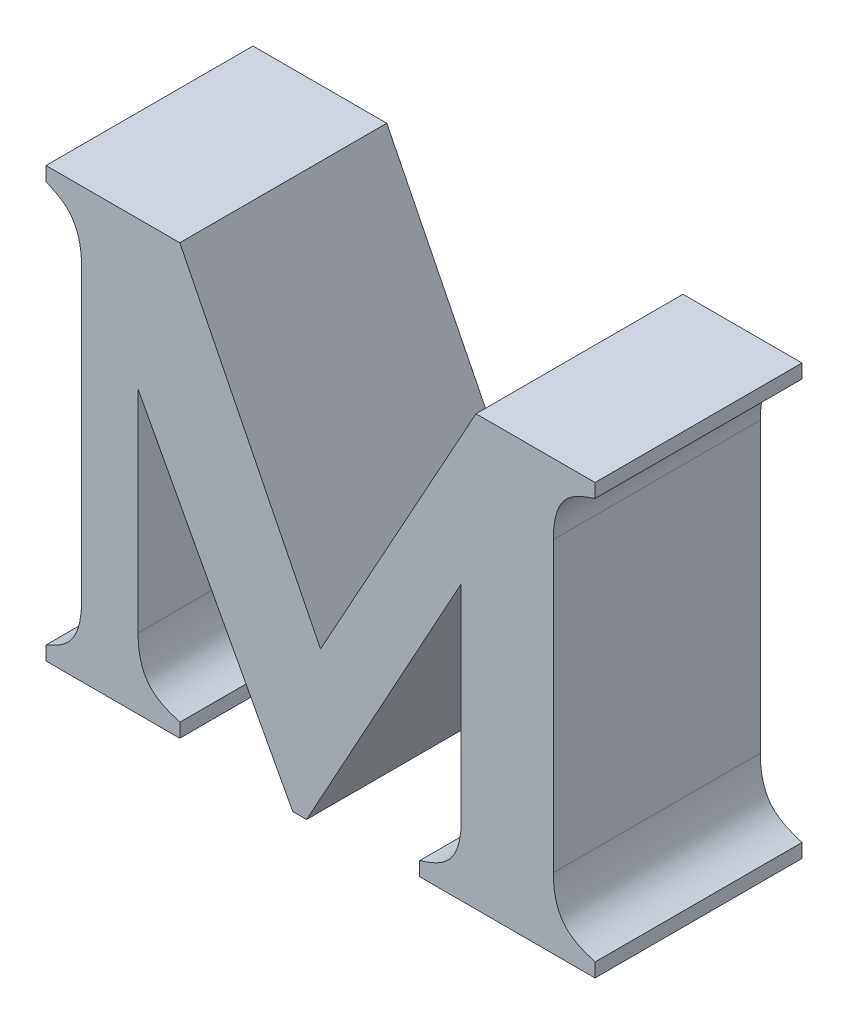
ISO-10303-21;
HEADER;
FILE_DESCRIPTION(('STEP AP214'),'2;1');
FILE_NAME('part.step','',(''),(''),'','','');
FILE_SCHEMA(('AUTOMOTIVE_DESIGN { 1 0 10303 214 1 1 1 1 }'));
ENDSEC;
DATA;
#1=APPLICATION_CONTEXT('core data for automotive mechanical design processes');
#2=APPLICATION_PROTOCOL_DEFINITION('international standard','automotive_design',2000,#1);
#3=PRODUCT_CONTEXT('',#1,'mechanical');
#4=PRODUCT('Part','Part','',(#3));
#5=PRODUCT_RELATED_PRODUCT_CATEGORY('part','',(#4));
#6=PRODUCT_DEFINITION_FORMATION('','',#4);
#7=PRODUCT_DEFINITION_CONTEXT('part definition',#1,'design');
#8=PRODUCT_DEFINITION('design','',#6,#7);
#9=PRODUCT_DEFINITION_SHAPE('','',#8);
#10=(LENGTH_UNIT() NAMED_UNIT(*) SI_UNIT(.MILLI.,.METRE.));
#11=(NAMED_UNIT(*) PLANE_ANGLE_UNIT() SI_UNIT($,.RADIAN.));
#12=(NAMED_UNIT(*) SI_UNIT($,.STERADIAN.) SOLID_ANGLE_UNIT());
#13=UNCERTAINTY_MEASURE_WITH_UNIT(LENGTH_MEASURE(1.E-05),#10,'distance_accuracy_value','');
#14=(GEOMETRIC_REPRESENTATION_CONTEXT(3) GLOBAL_UNCERTAINTY_ASSIGNED_CONTEXT((#13)) GLOBAL_UNIT_ASSIGNED_CONTEXT((#10,
#11,#12)) REPRESENTATION_CONTEXT('',''));
#15=CARTESIAN_POINT('',(0.,0.,0.));
#16=DIRECTION('',(0.,0.,1.));
#17=DIRECTION('',(1.,0.,0.));
#18=AXIS2_PLACEMENT_3D('',#15,#16,#17);
#19=CARTESIAN_POINT('',(1.967855914945,-0.25995003071244,0.));
#20=CARTESIAN_POINT('',(1.967855914945,-0.25995003071244,0.1));
#21=CARTESIAN_POINT('',(1.974991382156,-0.26330769945751,0.));
#22=CARTESIAN_POINT('',(1.974991382156,-0.26330769945751,0.1));
#23=CARTESIAN_POINT('',(1.985065074674,-0.26666549298124,0.));
#24=CARTESIAN_POINT('',(1.985065074674,-0.26666549298124,0.1));
#25=CARTESIAN_POINT('',(1.985065074674,-0.28723157278345,0.));
#26=CARTESIAN_POINT('',(1.985065074674,-0.28723157278345,0.1));
#27=B_SPLINE_SURFACE_WITH_KNOTS('',3,1,((#19,#20),(#21,#22),(#23,#24),(#25,#26)),.UNSPECIFIED.,
.F.,.F.,.F.,(4,4),(2,2),(-1.,0.),(0.,0.01),.UNSPECIFIED.);
#28=CARTESIAN_POINT('',(1.985065074674,-0.28723157278345,0.));
#29=CARTESIAN_POINT('',(1.985065074674,-0.26666549298124,0.));
#30=CARTESIAN_POINT('',(1.974991382156,-0.26330769945751,0.));
#31=CARTESIAN_POINT('',(1.967855914945,-0.25995003071244,0.));
#32=B_SPLINE_CURVE_WITH_KNOTS('',3,(#28,#29,#30,#31),.UNSPECIFIED.,.F.,.F.,(4,4),(0.,1.),.UNSPECIFIED.);
#33=CARTESIAN_POINT('',(1.985065074674,-0.28723157278345,0.));
#34=VERTEX_POINT('',#33);
#35=CARTESIAN_POINT('',(1.967855914945,-0.25995003071244,0.));
#36=VERTEX_POINT('',#35);
#37=EDGE_CURVE('E11',#34,#36,#32,.T.);
#38=DIRECTION('',(0.,0.,1.));
#39=VECTOR('',#38,1.);
#40=CARTESIAN_POINT('',(1.985065074674,-0.28723157278345,0.));
#41=LINE('',#40,#39);
#42=CARTESIAN_POINT('',(1.985065074674,-0.28723157278345,0.1));
#43=VERTEX_POINT('',#42);
#44=EDGE_CURVE('E28',#34,#43,#41,.T.);
#45=CARTESIAN_POINT('',(1.967855914945,-0.25995003071244,0.1));
#46=CARTESIAN_POINT('',(1.974991382156,-0.26330769945751,0.1));
#47=CARTESIAN_POINT('',(1.985065074674,-0.26666549298124,0.1));
#48=CARTESIAN_POINT('',(1.985065074674,-0.28723157278345,0.1));
#49=B_SPLINE_CURVE_WITH_KNOTS('',3,(#45,#46,#47,#48),.UNSPECIFIED.,.F.,.F.,(4,4),(-1.,0.),.UNSPECIFIED.);
#50=CARTESIAN_POINT('',(1.967855914945,-0.25995003071244,0.1));
#51=VERTEX_POINT('',#50);
#52=EDGE_CURVE('E206',#51,#43,#49,.T.);
#53=DIRECTION('',(0.,0.,1.));
#54=VECTOR('',#53,1.);
#55=CARTESIAN_POINT('',(1.967855914945,-0.25995003071244,0.));
#56=LINE('',#55,#54);
#57=EDGE_CURVE('E433',#36,#51,#56,.T.);
#58=ORIENTED_EDGE('',*,*,#37,.F.);
#59=ORIENTED_EDGE('',*,*,#44,.T.);
#60=ORIENTED_EDGE('',*,*,#52,.F.);
#61=ORIENTED_EDGE('',*,*,#57,.F.);
#62=EDGE_LOOP('',(#58,#59,#60,#61));
#63=FACE_BOUND('',#62,.T.);
#64=ADVANCED_FACE('F17',(#63),#27,.T.);
#65=CARTESIAN_POINT('',(1.967855914945,-0.25323453724898,0.));
#66=DIRECTION('',(-1.,0.,0.));
#67=DIRECTION('',(0.,-1.,0.));
#68=AXIS2_PLACEMENT_3D('',#65,#66,#67);
#69=PLANE('',#68);
#70=DIRECTION('',(0.,1.,0.));
#71=VECTOR('',#70,1.);
#72=CARTESIAN_POINT('',(1.967855914945,-0.25995003071244,0.));
#73=LINE('',#72,#71);
#74=CARTESIAN_POINT('',(1.967855914945,-0.25323453724898,0.));
#75=VERTEX_POINT('',#74);
#76=EDGE_CURVE('E431',#36,#75,#73,.T.);
#77=ORIENTED_EDGE('',*,*,#76,.F.);
#78=ORIENTED_EDGE('',*,*,#57,.T.);
#79=DIRECTION('',(0.,-1.,0.));
#80=VECTOR('',#79,1.);
#81=CARTESIAN_POINT('',(1.967855914945,-0.25995003071244,0.1));
#82=LINE('',#81,#80);
#83=CARTESIAN_POINT('',(1.967855914945,-0.25323453724898,0.1));
#84=VERTEX_POINT('',#83);
#85=EDGE_CURVE('E429',#84,#51,#82,.T.);
#86=ORIENTED_EDGE('',*,*,#85,.F.);
#87=DIRECTION('',(0.,0.,1.));
#88=VECTOR('',#87,1.);
#89=CARTESIAN_POINT('',(1.967855914945,-0.25323453724898,0.));
#90=LINE('',#89,#88);
#91=EDGE_CURVE('E426',#75,#84,#90,.T.);
#92=ORIENTED_EDGE('',*,*,#91,.F.);
#93=EDGE_LOOP('',(#77,#78,#86,#92));
#94=FACE_BOUND('',#93,.T.);
#95=ADVANCED_FACE('F528',(#94),#69,.T.);
#96=CARTESIAN_POINT('',(2.032492504437,-0.25323453724898,0.));
#97=DIRECTION('',(0.,1.,0.));
#98=DIRECTION('',(-1.,0.,0.));
#99=AXIS2_PLACEMENT_3D('',#96,#97,#98);
#100=PLANE('',#99);
#101=DIRECTION('',(1.,0.,0.));
#102=VECTOR('',#101,1.);
#103=CARTESIAN_POINT('',(1.967855914945,-0.25323453724898,0.));
#104=LINE('',#103,#102);
#105=CARTESIAN_POINT('',(2.032492504437,-0.25323453724898,0.));
#106=VERTEX_POINT('',#105);
#107=EDGE_CURVE('E424',#75,#106,#104,.T.);
#108=ORIENTED_EDGE('',*,*,#107,.F.);
#109=ORIENTED_EDGE('',*,*,#91,.T.);
#110=DIRECTION('',(-1.,0.,0.));
#111=VECTOR('',#110,1.);
#112=CARTESIAN_POINT('',(1.967855914945,-0.25323453724898,0.1));
#113=LINE('',#112,#111);
#114=CARTESIAN_POINT('',(2.032492504437,-0.25323453724898,0.1));
#115=VERTEX_POINT('',#114);
#116=EDGE_CURVE('E421',#115,#84,#113,.T.);
#117=ORIENTED_EDGE('',*,*,#116,.F.);
#118=DIRECTION('',(0.,0.,1.));
#119=VECTOR('',#118,1.);
#120=CARTESIAN_POINT('',(2.032492504437,-0.25323453724898,0.));
#121=LINE('',#120,#119);
#122=EDGE_CURVE('E418',#106,#115,#121,.T.);
#123=ORIENTED_EDGE('',*,*,#122,.F.);
#124=EDGE_LOOP('',(#108,#109,#117,#123));
#125=FACE_BOUND('',#124,.T.);
#126=ADVANCED_FACE('F524',(#125),#100,.T.);
#127=CARTESIAN_POINT('',(2.100486575506,-0.389222679387,0.));
#128=DIRECTION('',(0.894427190999942,0.447213595499906,0.));
#129=DIRECTION('',(-0.447213595499906,0.894427190999942,0.));
#130=AXIS2_PLACEMENT_3D('',#127,#128,#129);
#131=PLANE('',#130);
#132=DIRECTION('',(0.447213595499906,-0.894427190999942,0.));
#133=VECTOR('',#132,1.);
#134=CARTESIAN_POINT('',(2.032492504437,-0.25323453724898,0.));
#135=LINE('',#134,#133);
#136=CARTESIAN_POINT('',(2.100486575506,-0.389222679387,0.));
#137=VERTEX_POINT('',#136);
#138=EDGE_CURVE('E416',#106,#137,#135,.T.);
#139=ORIENTED_EDGE('',*,*,#138,.F.);
#140=ORIENTED_EDGE('',*,*,#122,.T.);
#141=DIRECTION('',(-0.447213595499906,0.894427190999942,0.));
#142=VECTOR('',#141,1.);
#143=CARTESIAN_POINT('',(2.032492504437,-0.25323453724898,0.1));
#144=LINE('',#143,#142);
#145=CARTESIAN_POINT('',(2.100486575506,-0.389222679387,0.1));
#146=VERTEX_POINT('',#145);
#147=EDGE_CURVE('E413',#146,#115,#144,.T.);
#148=ORIENTED_EDGE('',*,*,#147,.F.);
#149=DIRECTION('',(0.,0.,1.));
#150=VECTOR('',#149,1.);
#151=CARTESIAN_POINT('',(2.100486575506,-0.389222679387,0.));
#152=LINE('',#151,#150);
#153=EDGE_CURVE('E410',#137,#146,#152,.T.);
#154=ORIENTED_EDGE('',*,*,#153,.F.);
#155=EDGE_LOOP('',(#139,#140,#148,#154));
#156=FACE_BOUND('',#155,.T.);
#157=ADVANCED_FACE('F520',(#156),#131,.T.);
#158=CARTESIAN_POINT('',(2.175615801839,-0.25323453724898,0.));
#159=DIRECTION('',(-0.875301790518292,0.483577062644076,0.));
#160=DIRECTION('',(-0.483577062644076,-0.875301790518292,0.));
#161=AXIS2_PLACEMENT_3D('',#158,#159,#160);
#162=PLANE('',#161);
#163=DIRECTION('',(0.483577062644076,0.875301790518292,0.));
#164=VECTOR('',#163,1.);
#165=CARTESIAN_POINT('',(2.100486575506,-0.389222679387,0.));
#166=LINE('',#165,#164);
#167=CARTESIAN_POINT('',(2.175615801839,-0.25323453724898,0.));
#168=VERTEX_POINT('',#167);
#169=EDGE_CURVE('E408',#137,#168,#166,.T.);
#170=ORIENTED_EDGE('',*,*,#169,.F.);
#171=ORIENTED_EDGE('',*,*,#153,.T.);
#172=DIRECTION('',(-0.483577062644076,-0.875301790518292,0.));
#173=VECTOR('',#172,1.);
#174=CARTESIAN_POINT('',(2.100486575506,-0.389222679387,0.1));
#175=LINE('',#174,#173);
#176=CARTESIAN_POINT('',(2.175615801839,-0.25323453724898,0.1));
#177=VERTEX_POINT('',#176);
#178=EDGE_CURVE('E405',#177,#146,#175,.T.);
#179=ORIENTED_EDGE('',*,*,#178,.F.);
#180=DIRECTION('',(0.,0.,1.));
#181=VECTOR('',#180,1.);
#182=CARTESIAN_POINT('',(2.175615801839,-0.25323453724898,0.));
#183=LINE('',#182,#181);
#184=EDGE_CURVE('E402',#168,#177,#183,.T.);
#185=ORIENTED_EDGE('',*,*,#184,.F.);
#186=EDGE_LOOP('',(#170,#171,#179,#185));
#187=FACE_BOUND('',#186,.T.);
#188=ADVANCED_FACE('F516',(#187),#162,.T.);
#189=CARTESIAN_POINT('',(2.23311692412,-0.25323453724898,0.));
#190=DIRECTION('',(0.,1.,0.));
#191=DIRECTION('',(-1.,0.,0.));
#192=AXIS2_PLACEMENT_3D('',#189,#190,#191);
#193=PLANE('',#192);
#194=DIRECTION('',(1.,0.,0.));
#195=VECTOR('',#194,1.);
#196=CARTESIAN_POINT('',(2.175615801839,-0.25323453724898,0.));
#197=LINE('',#196,#195);
#198=CARTESIAN_POINT('',(2.23311692412,-0.25323453724898,0.));
#199=VERTEX_POINT('',#198);
#200=EDGE_CURVE('E400',#168,#199,#197,.T.);
#201=ORIENTED_EDGE('',*,*,#200,.F.);
#202=ORIENTED_EDGE('',*,*,#184,.T.);
#203=DIRECTION('',(-1.,0.,0.));
#204=VECTOR('',#203,1.);
#205=CARTESIAN_POINT('',(2.175615801839,-0.25323453724898,0.1));
#206=LINE('',#205,#204);
#207=CARTESIAN_POINT('',(2.23311692412,-0.25323453724898,0.1));
#208=VERTEX_POINT('',#207);
#209=EDGE_CURVE('E397',#208,#177,#206,.T.);
#210=ORIENTED_EDGE('',*,*,#209,.F.);
#211=DIRECTION('',(0.,0.,1.));
#212=VECTOR('',#211,1.);
#213=CARTESIAN_POINT('',(2.23311692412,-0.25323453724898,0.));
#214=LINE('',#213,#212);
#215=EDGE_CURVE('E394',#199,#208,#214,.T.);
#216=ORIENTED_EDGE('',*,*,#215,.F.);
#217=EDGE_LOOP('',(#201,#202,#210,#216));
#218=FACE_BOUND('',#217,.T.);
#219=ADVANCED_FACE('F512',(#218),#193,.T.);
#220=CARTESIAN_POINT('',(2.23311692412,-0.25995003071244,0.));
#221=DIRECTION('',(1.,0.,0.));
#222=DIRECTION('',(0.,1.,0.));
#223=AXIS2_PLACEMENT_3D('',#220,#221,#222);
#224=PLANE('',#223);
#225=DIRECTION('',(0.,-1.,0.));
#226=VECTOR('',#225,1.);
#227=CARTESIAN_POINT('',(2.23311692412,-0.25323453724898,0.));
#228=LINE('',#227,#226);
#229=CARTESIAN_POINT('',(2.23311692412,-0.25995003071244,0.));
#230=VERTEX_POINT('',#229);
#231=EDGE_CURVE('E392',#199,#230,#228,.T.);
#232=ORIENTED_EDGE('',*,*,#231,.F.);
#233=ORIENTED_EDGE('',*,*,#215,.T.);
#234=DIRECTION('',(0.,1.,0.));
#235=VECTOR('',#234,1.);
#236=CARTESIAN_POINT('',(2.23311692412,-0.25323453724898,0.1));
#237=LINE('',#236,#235);
#238=CARTESIAN_POINT('',(2.23311692412,-0.25995003071244,0.1));
#239=VERTEX_POINT('',#238);
#240=EDGE_CURVE('E389',#239,#208,#237,.T.);
#241=ORIENTED_EDGE('',*,*,#240,.F.);
#242=DIRECTION('',(0.,0.,1.));
#243=VECTOR('',#242,1.);
#244=CARTESIAN_POINT('',(2.23311692412,-0.25995003071244,0.));
#245=LINE('',#244,#243);
#246=EDGE_CURVE('E383',#230,#239,#245,.T.);
#247=ORIENTED_EDGE('',*,*,#246,.F.);
#248=EDGE_LOOP('',(#232,#233,#241,#247));
#249=FACE_BOUND('',#248,.T.);
#250=ADVANCED_FACE('F508',(#249),#224,.T.);
#251=CARTESIAN_POINT('',(2.212970786871,-0.28723157278345,0.));
#252=CARTESIAN_POINT('',(2.212970786871,-0.28723157278345,0.1));
#253=CARTESIAN_POINT('',(2.212970786871,-0.26666549298124,0.));
#254=CARTESIAN_POINT('',(2.212970786871,-0.26666549298124,0.1));
#255=CARTESIAN_POINT('',(2.223043231602,-0.26330769945751,0.));
#256=CARTESIAN_POINT('',(2.223043231602,-0.26330769945751,0.1));
#257=CARTESIAN_POINT('',(2.23311692412,-0.25995003071244,0.));
#258=CARTESIAN_POINT('',(2.23311692412,-0.25995003071244,0.1));
#259=B_SPLINE_SURFACE_WITH_KNOTS('',3,1,((#251,#252),(#253,#254),(#255,#256),(#257,#258)),
.UNSPECIFIED.,.F.,.F.,.F.,(4,4),(2,2),(-1.,0.),(0.,0.01),.UNSPECIFIED.);
#260=CARTESIAN_POINT('',(2.23311692412,-0.25995003071244,0.));
#261=CARTESIAN_POINT('',(2.223043231602,-0.26330769945751,0.));
#262=CARTESIAN_POINT('',(2.212970786871,-0.26666549298124,0.));
#263=CARTESIAN_POINT('',(2.212970786871,-0.28723157278345,0.));
#264=B_SPLINE_CURVE_WITH_KNOTS('',3,(#260,#261,#262,#263),.UNSPECIFIED.,.F.,.F.,(4,4),(0.,1.),.UNSPECIFIED.);
#265=CARTESIAN_POINT('',(2.212970786871,-0.28723157278345,0.));
#266=VERTEX_POINT('',#265);
#267=EDGE_CURVE('E376',#230,#266,#264,.T.);
#268=CARTESIAN_POINT('',(2.212970786871,-0.28723157278345,0.1));
#269=CARTESIAN_POINT('',(2.212970786871,-0.26666549298124,0.1));
#270=CARTESIAN_POINT('',(2.223043231602,-0.26330769945751,0.1));
#271=CARTESIAN_POINT('',(2.23311692412,-0.25995003071244,0.1));
#272=B_SPLINE_CURVE_WITH_KNOTS('',3,(#268,#269,#270,#271),.UNSPECIFIED.,.F.,.F.,(4,4),(-1.,0.),.UNSPECIFIED.);
#273=CARTESIAN_POINT('',(2.212970786871,-0.28723157278345,0.1));
#274=VERTEX_POINT('',#273);
#275=EDGE_CURVE('E371',#274,#239,#272,.T.);
#276=DIRECTION('',(0.,0.,1.));
#277=VECTOR('',#276,1.);
#278=CARTESIAN_POINT('',(2.212970786871,-0.28723157278345,0.));
#279=LINE('',#278,#277);
#280=EDGE_CURVE('E368',#266,#274,#279,.T.);
#281=ORIENTED_EDGE('',*,*,#267,.F.);
#282=ORIENTED_EDGE('',*,*,#246,.T.);
#283=ORIENTED_EDGE('',*,*,#275,.F.);
#284=ORIENTED_EDGE('',*,*,#280,.F.);
#285=EDGE_LOOP('',(#281,#282,#283,#284));
#286=FACE_BOUND('',#285,.T.);
#287=ADVANCED_FACE('F504',(#286),#259,.T.);
#288=CARTESIAN_POINT('',(2.212970786871,-0.426577508445,0.));
#289=DIRECTION('',(1.,0.,0.));
#290=DIRECTION('',(0.,1.,0.));
#291=AXIS2_PLACEMENT_3D('',#288,#289,#290);
#292=PLANE('',#291);
#293=DIRECTION('',(0.,-1.,0.));
#294=VECTOR('',#293,1.);
#295=CARTESIAN_POINT('',(2.212970786871,-0.28723157278345,0.));
#296=LINE('',#295,#294);
#297=CARTESIAN_POINT('',(2.212970786871,-0.426577508445,0.));
#298=VERTEX_POINT('',#297);
#299=EDGE_CURVE('E366',#266,#298,#296,.T.);
#300=ORIENTED_EDGE('',*,*,#299,.F.);
#301=ORIENTED_EDGE('',*,*,#280,.T.);
#302=DIRECTION('',(0.,1.,0.));
#303=VECTOR('',#302,1.);
#304=CARTESIAN_POINT('',(2.212970786871,-0.28723157278345,0.1));
#305=LINE('',#304,#303);
#306=CARTESIAN_POINT('',(2.212970786871,-0.426577508445,0.1));
#307=VERTEX_POINT('',#306);
#308=EDGE_CURVE('E363',#307,#274,#305,.T.);
#309=ORIENTED_EDGE('',*,*,#308,.F.);
#310=DIRECTION('',(0.,0.,1.));
#311=VECTOR('',#310,1.);
#312=CARTESIAN_POINT('',(2.212970786871,-0.426577508445,0.));
#313=LINE('',#312,#311);
#314=EDGE_CURVE('E357',#298,#307,#313,.T.);
#315=ORIENTED_EDGE('',*,*,#314,.F.);
#316=EDGE_LOOP('',(#300,#301,#309,#315));
#317=FACE_BOUND('',#316,.T.);
#318=ADVANCED_FACE('F500',(#317),#292,.T.);
#319=CARTESIAN_POINT('',(2.23311692412,-0.453859050516,0.));
#320=CARTESIAN_POINT('',(2.23311692412,-0.453859050516,0.1));
#321=CARTESIAN_POINT('',(2.223043231602,-0.450501256992,0.));
#322=CARTESIAN_POINT('',(2.223043231602,-0.450501256992,0.1));
#323=CARTESIAN_POINT('',(2.212970786871,-0.447143557053,0.));
#324=CARTESIAN_POINT('',(2.212970786871,-0.447143557053,0.1));
#325=CARTESIAN_POINT('',(2.212970786871,-0.426577508445,0.));
#326=CARTESIAN_POINT('',(2.212970786871,-0.426577508445,0.1));
#327=B_SPLINE_SURFACE_WITH_KNOTS('',3,1,((#319,#320),(#321,#322),(#323,#324),(#325,#326)),
.UNSPECIFIED.,.F.,.F.,.F.,(4,4),(2,2),(-1.,0.),(0.,0.01),.UNSPECIFIED.);
#328=CARTESIAN_POINT('',(2.212970786871,-0.426577508445,0.));
#329=CARTESIAN_POINT('',(2.212970786871,-0.447143557053,0.));
#330=CARTESIAN_POINT('',(2.223043231602,-0.450501256992,0.));
#331=CARTESIAN_POINT('',(2.23311692412,-0.453859050516,0.));
#332=B_SPLINE_CURVE_WITH_KNOTS('',3,(#328,#329,#330,#331),.UNSPECIFIED.,.F.,.F.,(4,4),(0.,1.),.UNSPECIFIED.);
#333=CARTESIAN_POINT('',(2.23311692412,-0.453859050516,0.));
#334=VERTEX_POINT('',#333);
#335=EDGE_CURVE('E350',#298,#334,#332,.T.);
#336=CARTESIAN_POINT('',(2.23311692412,-0.453859050516,0.1));
#337=CARTESIAN_POINT('',(2.223043231602,-0.450501256992,0.1));
#338=CARTESIAN_POINT('',(2.212970786871,-0.447143557053,0.1));
#339=CARTESIAN_POINT('',(2.212970786871,-0.426577508445,0.1));
#340=B_SPLINE_CURVE_WITH_KNOTS('',3,(#336,#337,#338,#339),.UNSPECIFIED.,.F.,.F.,(4,4),(-1.,0.),.UNSPECIFIED.);
#341=CARTESIAN_POINT('',(2.23311692412,-0.453859050516,0.1));
#342=VERTEX_POINT('',#341);
#343=EDGE_CURVE('E345',#342,#307,#340,.T.);
#344=DIRECTION('',(0.,0.,1.));
#345=VECTOR('',#344,1.);
#346=CARTESIAN_POINT('',(2.23311692412,-0.453859050516,0.));
#347=LINE('',#346,#345);
#348=EDGE_CURVE('E342',#334,#342,#347,.T.);
#349=ORIENTED_EDGE('',*,*,#335,.F.);
#350=ORIENTED_EDGE('',*,*,#314,.T.);
#351=ORIENTED_EDGE('',*,*,#343,.F.);
#352=ORIENTED_EDGE('',*,*,#348,.F.);
#353=EDGE_LOOP('',(#349,#350,#351,#352));
#354=FACE_BOUND('',#353,.T.);
#355=ADVANCED_FACE('F496',(#354),#327,.T.);
#356=CARTESIAN_POINT('',(2.23311692412,-0.46057454398,0.));
#357=DIRECTION('',(1.,0.,0.));
#358=DIRECTION('',(0.,1.,0.));
#359=AXIS2_PLACEMENT_3D('',#356,#357,#358);
#360=PLANE('',#359);
#361=DIRECTION('',(0.,-1.,0.));
#362=VECTOR('',#361,1.);
#363=CARTESIAN_POINT('',(2.23311692412,-0.453859050516,0.));
#364=LINE('',#363,#362);
#365=CARTESIAN_POINT('',(2.23311692412,-0.46057454398,0.));
#366=VERTEX_POINT('',#365);
#367=EDGE_CURVE('E340',#334,#366,#364,.T.);
#368=ORIENTED_EDGE('',*,*,#367,.F.);
#369=ORIENTED_EDGE('',*,*,#348,.T.);
#370=DIRECTION('',(0.,1.,0.));
#371=VECTOR('',#370,1.);
#372=CARTESIAN_POINT('',(2.23311692412,-0.453859050516,0.1));
#373=LINE('',#372,#371);
#374=CARTESIAN_POINT('',(2.23311692412,-0.46057454398,0.1));
#375=VERTEX_POINT('',#374);
#376=EDGE_CURVE('E337',#375,#342,#373,.T.);
#377=ORIENTED_EDGE('',*,*,#376,.F.);
#378=DIRECTION('',(0.,0.,1.));
#379=VECTOR('',#378,1.);
#380=CARTESIAN_POINT('',(2.23311692412,-0.46057454398,0.));
#381=LINE('',#380,#379);
#382=EDGE_CURVE('E334',#366,#375,#381,.T.);
#383=ORIENTED_EDGE('',*,*,#382,.F.);
#384=EDGE_LOOP('',(#368,#369,#377,#383));
#385=FACE_BOUND('',#384,.T.);
#386=ADVANCED_FACE('F492',(#385),#360,.T.);
#387=CARTESIAN_POINT('',(2.148334197379,-0.46057454398,0.));
#388=DIRECTION('',(0.,-1.,0.));
#389=DIRECTION('',(1.,0.,0.));
#390=AXIS2_PLACEMENT_3D('',#387,#388,#389);
#391=PLANE('',#390);
#392=DIRECTION('',(-1.,0.,0.));
#393=VECTOR('',#392,1.);
#394=CARTESIAN_POINT('',(2.23311692412,-0.46057454398,0.));
#395=LINE('',#394,#393);
#396=CARTESIAN_POINT('',(2.148334197379,-0.46057454398,0.));
#397=VERTEX_POINT('',#396);
#398=EDGE_CURVE('E332',#366,#397,#395,.T.);
#399=ORIENTED_EDGE('',*,*,#398,.F.);
#400=ORIENTED_EDGE('',*,*,#382,.T.);
#401=DIRECTION('',(1.,0.,0.));
#402=VECTOR('',#401,1.);
#403=CARTESIAN_POINT('',(2.23311692412,-0.46057454398,0.1));
#404=LINE('',#403,#402);
#405=CARTESIAN_POINT('',(2.148334197379,-0.46057454398,0.1));
#406=VERTEX_POINT('',#405);
#407=EDGE_CURVE('E329',#406,#375,#404,.T.);
#408=ORIENTED_EDGE('',*,*,#407,.F.);
#409=DIRECTION('',(0.,0.,1.));
#410=VECTOR('',#409,1.);
#411=CARTESIAN_POINT('',(2.148334197379,-0.46057454398,0.));
#412=LINE('',#411,#410);
#413=EDGE_CURVE('E326',#397,#406,#412,.T.);
#414=ORIENTED_EDGE('',*,*,#413,.F.);
#415=EDGE_LOOP('',(#399,#400,#408,#414));
#416=FACE_BOUND('',#415,.T.);
#417=ADVANCED_FACE('F488',(#416),#391,.T.);
#418=CARTESIAN_POINT('',(2.148334197379,-0.453859050516,0.));
#419=DIRECTION('',(-1.,0.,0.));
#420=DIRECTION('',(0.,-1.,0.));
#421=AXIS2_PLACEMENT_3D('',#418,#419,#420);
#422=PLANE('',#421);
#423=DIRECTION('',(0.,1.,0.));
#424=VECTOR('',#423,1.);
#425=CARTESIAN_POINT('',(2.148334197379,-0.46057454398,0.));
#426=LINE('',#425,#424);
#427=CARTESIAN_POINT('',(2.148334197379,-0.453859050516,0.));
#428=VERTEX_POINT('',#427);
#429=EDGE_CURVE('E324',#397,#428,#426,.T.);
#430=ORIENTED_EDGE('',*,*,#429,.F.);
#431=ORIENTED_EDGE('',*,*,#413,.T.);
#432=DIRECTION('',(0.,-1.,0.));
#433=VECTOR('',#432,1.);
#434=CARTESIAN_POINT('',(2.148334197379,-0.46057454398,0.1));
#435=LINE('',#434,#433);
#436=CARTESIAN_POINT('',(2.148334197379,-0.453859050516,0.1));
#437=VERTEX_POINT('',#436);
#438=EDGE_CURVE('E321',#437,#406,#435,.T.);
#439=ORIENTED_EDGE('',*,*,#438,.F.);
#440=DIRECTION('',(0.,0.,1.));
#441=VECTOR('',#440,1.);
#442=CARTESIAN_POINT('',(2.148334197379,-0.453859050516,0.));
#443=LINE('',#442,#441);
#444=EDGE_CURVE('E315',#428,#437,#443,.T.);
#445=ORIENTED_EDGE('',*,*,#444,.F.);
#446=EDGE_LOOP('',(#430,#431,#439,#445));
#447=FACE_BOUND('',#446,.T.);
#448=ADVANCED_FACE('F484',(#447),#422,.T.);
#449=CARTESIAN_POINT('',(2.168480334628,-0.426577508445,0.));
#450=CARTESIAN_POINT('',(2.168480334628,-0.426577508445,0.1));
#451=CARTESIAN_POINT('',(2.168480334628,-0.447143557053,0.));
#452=CARTESIAN_POINT('',(2.168480334628,-0.447143557053,0.1));
#453=CARTESIAN_POINT('',(2.158407889897,-0.450501256992,0.));
#454=CARTESIAN_POINT('',(2.158407889897,-0.450501256992,0.1));
#455=CARTESIAN_POINT('',(2.148334197379,-0.453859050516,0.));
#456=CARTESIAN_POINT('',(2.148334197379,-0.453859050516,0.1));
#457=B_SPLINE_SURFACE_WITH_KNOTS('',3,1,((#449,#450),(#451,#452),(#453,#454),(#455,#456)),
.UNSPECIFIED.,.F.,.F.,.F.,(4,4),(2,2),(-1.,0.),(0.,0.01),.UNSPECIFIED.);
#458=CARTESIAN_POINT('',(2.148334197379,-0.453859050516,0.));
#459=CARTESIAN_POINT('',(2.158407889897,-0.450501256992,0.));
#460=CARTESIAN_POINT('',(2.168480334628,-0.447143557053,0.));
#461=CARTESIAN_POINT('',(2.168480334628,-0.426577508445,0.));
#462=B_SPLINE_CURVE_WITH_KNOTS('',3,(#458,#459,#460,#461),.UNSPECIFIED.,.F.,.F.,(4,4),(0.,1.),.UNSPECIFIED.);
#463=CARTESIAN_POINT('',(2.168480334628,-0.426577508445,0.));
#464=VERTEX_POINT('',#463);
#465=EDGE_CURVE('E308',#428,#464,#462,.T.);
#466=CARTESIAN_POINT('',(2.168480334628,-0.426577508445,0.1));
#467=CARTESIAN_POINT('',(2.168480334628,-0.447143557053,0.1));
#468=CARTESIAN_POINT('',(2.158407889897,-0.450501256992,0.1));
#469=CARTESIAN_POINT('',(2.148334197379,-0.453859050516,0.1));
#470=B_SPLINE_CURVE_WITH_KNOTS('',3,(#466,#467,#468,#469),.UNSPECIFIED.,.F.,.F.,(4,4),(-1.,0.),.UNSPECIFIED.);
#471=CARTESIAN_POINT('',(2.168480334628,-0.426577508445,0.1));
#472=VERTEX_POINT('',#471);
#473=EDGE_CURVE('E303',#472,#437,#470,.T.);
#474=DIRECTION('',(0.,0.,1.));
#475=VECTOR('',#474,1.);
#476=CARTESIAN_POINT('',(2.168480334628,-0.426577508445,0.));
#477=LINE('',#476,#475);
#478=EDGE_CURVE('E300',#464,#472,#477,.T.);
#479=ORIENTED_EDGE('',*,*,#465,.F.);
#480=ORIENTED_EDGE('',*,*,#444,.T.);
#481=ORIENTED_EDGE('',*,*,#473,.F.);
#482=ORIENTED_EDGE('',*,*,#478,.F.);
#483=EDGE_LOOP('',(#479,#480,#481,#482));
#484=FACE_BOUND('',#483,.T.);
#485=ADVANCED_FACE('F480',(#484),#457,.T.);
#486=CARTESIAN_POINT('',(2.168480334628,-0.327944070587,0.));
#487=DIRECTION('',(-1.,0.,0.));
#488=DIRECTION('',(0.,-1.,0.));
#489=AXIS2_PLACEMENT_3D('',#486,#487,#488);
#490=PLANE('',#489);
#491=DIRECTION('',(0.,1.,0.));
#492=VECTOR('',#491,1.);
#493=CARTESIAN_POINT('',(2.168480334628,-0.426577508445,0.));
#494=LINE('',#493,#492);
#495=CARTESIAN_POINT('',(2.168480334628,-0.327944070587,0.));
#496=VERTEX_POINT('',#495);
#497=EDGE_CURVE('E298',#464,#496,#494,.T.);
#498=ORIENTED_EDGE('',*,*,#497,.F.);
#499=ORIENTED_EDGE('',*,*,#478,.T.);
#500=DIRECTION('',(0.,-1.,0.));
#501=VECTOR('',#500,1.);
#502=CARTESIAN_POINT('',(2.168480334628,-0.426577508445,0.1));
#503=LINE('',#502,#501);
#504=CARTESIAN_POINT('',(2.168480334628,-0.327944070587,0.1));
#505=VERTEX_POINT('',#504);
#506=EDGE_CURVE('E295',#505,#472,#503,.T.);
#507=ORIENTED_EDGE('',*,*,#506,.F.);
#508=DIRECTION('',(0.,0.,1.));
#509=VECTOR('',#508,1.);
#510=CARTESIAN_POINT('',(2.168480334628,-0.327944070587,0.));
#511=LINE('',#510,#509);
#512=EDGE_CURVE('E292',#496,#505,#511,.T.);
#513=ORIENTED_EDGE('',*,*,#512,.F.);
#514=EDGE_LOOP('',(#498,#499,#507,#513));
#515=FACE_BOUND('',#514,.T.);
#516=ADVANCED_FACE('F476',(#515),#490,.T.);
#517=CARTESIAN_POINT('',(2.093770988458,-0.463932212725,0.));
#518=DIRECTION('',(0.876444775107035,-0.481502394789039,0.));
#519=DIRECTION('',(0.481502394789039,0.876444775107035,0.));
#520=AXIS2_PLACEMENT_3D('',#517,#518,#519);
#521=PLANE('',#520);
#522=DIRECTION('',(-0.481502394789039,-0.876444775107035,0.));
#523=VECTOR('',#522,1.);
#524=CARTESIAN_POINT('',(2.168480334628,-0.327944070587,0.));
#525=LINE('',#524,#523);
#526=CARTESIAN_POINT('',(2.093770988458,-0.463932212725,0.));
#527=VERTEX_POINT('',#526);
#528=EDGE_CURVE('E290',#496,#527,#525,.T.);
#529=ORIENTED_EDGE('',*,*,#528,.F.);
#530=ORIENTED_EDGE('',*,*,#512,.T.);
#531=DIRECTION('',(0.481502394789039,0.876444775107035,0.));
#532=VECTOR('',#531,1.);
#533=CARTESIAN_POINT('',(2.168480334628,-0.327944070587,0.1));
#534=LINE('',#533,#532);
#535=CARTESIAN_POINT('',(2.093770988458,-0.463932212725,0.1));
#536=VERTEX_POINT('',#535);
#537=EDGE_CURVE('E287',#536,#505,#534,.T.);
#538=ORIENTED_EDGE('',*,*,#537,.F.);
#539=DIRECTION('',(0.,0.,1.));
#540=VECTOR('',#539,1.);
#541=CARTESIAN_POINT('',(2.093770988458,-0.463932212725,0.));
#542=LINE('',#541,#540);
#543=EDGE_CURVE('E284',#527,#536,#542,.T.);
#544=ORIENTED_EDGE('',*,*,#543,.F.);
#545=EDGE_LOOP('',(#529,#530,#538,#544));
#546=FACE_BOUND('',#545,.T.);
#547=ADVANCED_FACE('F472',(#546),#521,.T.);
#548=CARTESIAN_POINT('',(2.087055713357,-0.463932212725,0.));
#549=DIRECTION('',(0.,-1.,0.));
#550=DIRECTION('',(1.,0.,0.));
#551=AXIS2_PLACEMENT_3D('',#548,#549,#550);
#552=PLANE('',#551);
#553=DIRECTION('',(-1.,0.,0.));
#554=VECTOR('',#553,1.);
#555=CARTESIAN_POINT('',(2.093770988458,-0.463932212725,0.));
#556=LINE('',#555,#554);
#557=CARTESIAN_POINT('',(2.087055713357,-0.463932212725,0.));
#558=VERTEX_POINT('',#557);
#559=EDGE_CURVE('E282',#527,#558,#556,.T.);
#560=ORIENTED_EDGE('',*,*,#559,.F.);
#561=ORIENTED_EDGE('',*,*,#543,.T.);
#562=DIRECTION('',(1.,0.,0.));
#563=VECTOR('',#562,1.);
#564=CARTESIAN_POINT('',(2.093770988458,-0.463932212725,0.1));
#565=LINE('',#564,#563);
#566=CARTESIAN_POINT('',(2.087055713357,-0.463932212725,0.1));
#567=VERTEX_POINT('',#566);
#568=EDGE_CURVE('E279',#567,#536,#565,.T.);
#569=ORIENTED_EDGE('',*,*,#568,.F.);
#570=DIRECTION('',(0.,0.,1.));
#571=VECTOR('',#570,1.);
#572=CARTESIAN_POINT('',(2.087055713357,-0.463932212725,0.));
#573=LINE('',#572,#571);
#574=EDGE_CURVE('E276',#558,#567,#573,.T.);
#575=ORIENTED_EDGE('',*,*,#574,.F.);
#576=EDGE_LOOP('',(#560,#561,#569,#575));
#577=FACE_BOUND('',#576,.T.);
#578=ADVANCED_FACE('F468',(#577),#552,.T.);
#579=CARTESIAN_POINT('',(2.012346679134,-0.324586401842,0.));
#580=DIRECTION('',(-0.881323295859111,-0.472513754483438,0.));
#581=DIRECTION('',(0.472513754483438,-0.881323295859111,0.));
#582=AXIS2_PLACEMENT_3D('',#579,#580,#581);
#583=PLANE('',#582);
#584=DIRECTION('',(-0.472513754483438,0.881323295859111,0.));
#585=VECTOR('',#584,1.);
#586=CARTESIAN_POINT('',(2.087055713357,-0.463932212725,0.));
#587=LINE('',#586,#585);
#588=CARTESIAN_POINT('',(2.012346679134,-0.324586401842,0.));
#589=VERTEX_POINT('',#588);
#590=EDGE_CURVE('E274',#558,#589,#587,.T.);
#591=ORIENTED_EDGE('',*,*,#590,.F.);
#592=ORIENTED_EDGE('',*,*,#574,.T.);
#593=DIRECTION('',(0.472513754483438,-0.881323295859111,0.));
#594=VECTOR('',#593,1.);
#595=CARTESIAN_POINT('',(2.087055713357,-0.463932212725,0.1));
#596=LINE('',#595,#594);
#597=CARTESIAN_POINT('',(2.012346679134,-0.324586401842,0.1));
#598=VERTEX_POINT('',#597);
#599=EDGE_CURVE('E271',#598,#567,#596,.T.);
#600=ORIENTED_EDGE('',*,*,#599,.F.);
#601=DIRECTION('',(0.,0.,1.));
#602=VECTOR('',#601,1.);
#603=CARTESIAN_POINT('',(2.012346679134,-0.324586401842,0.));
#604=LINE('',#603,#602);
#605=EDGE_CURVE('E268',#589,#598,#604,.T.);
#606=ORIENTED_EDGE('',*,*,#605,.F.);
#607=EDGE_LOOP('',(#591,#592,#600,#606));
#608=FACE_BOUND('',#607,.T.);
#609=ADVANCED_FACE('F464',(#608),#583,.T.);
#610=CARTESIAN_POINT('',(2.012346679134,-0.426577508445,0.));
#611=DIRECTION('',(1.,0.,0.));
#612=DIRECTION('',(0.,1.,0.));
#613=AXIS2_PLACEMENT_3D('',#610,#611,#612);
#614=PLANE('',#613);
#615=DIRECTION('',(0.,-1.,0.));
#616=VECTOR('',#615,1.);
#617=CARTESIAN_POINT('',(2.012346679134,-0.324586401842,0.));
#618=LINE('',#617,#616);
#619=CARTESIAN_POINT('',(2.012346679134,-0.426577508445,0.));
#620=VERTEX_POINT('',#619);
#621=EDGE_CURVE('E266',#589,#620,#618,.T.);
#622=ORIENTED_EDGE('',*,*,#621,.F.);
#623=ORIENTED_EDGE('',*,*,#605,.T.);
#624=DIRECTION('',(0.,1.,0.));
#625=VECTOR('',#624,1.);
#626=CARTESIAN_POINT('',(2.012346679134,-0.324586401842,0.1));
#627=LINE('',#626,#625);
#628=CARTESIAN_POINT('',(2.012346679134,-0.426577508445,0.1));
#629=VERTEX_POINT('',#628);
#630=EDGE_CURVE('E263',#629,#598,#627,.T.);
#631=ORIENTED_EDGE('',*,*,#630,.F.);
#632=DIRECTION('',(0.,0.,1.));
#633=VECTOR('',#632,1.);
#634=CARTESIAN_POINT('',(2.012346679134,-0.426577508445,0.));
#635=LINE('',#634,#633);
#636=EDGE_CURVE('E257',#620,#629,#635,.T.);
#637=ORIENTED_EDGE('',*,*,#636,.F.);
#638=EDGE_LOOP('',(#622,#623,#631,#637));
#639=FACE_BOUND('',#638,.T.);
#640=ADVANCED_FACE('F460',(#639),#614,.T.);
#641=CARTESIAN_POINT('',(2.032492504437,-0.453859050516,0.));
#642=CARTESIAN_POINT('',(2.032492504437,-0.453859050516,0.1));
#643=CARTESIAN_POINT('',(2.022418811919,-0.450501256992,0.));
#644=CARTESIAN_POINT('',(2.022418811919,-0.450501256992,0.1));
#645=CARTESIAN_POINT('',(2.012346679134,-0.447143557053001,0.));
#646=CARTESIAN_POINT('',(2.012346679134,-0.447143557053001,0.1));
#647=CARTESIAN_POINT('',(2.012346679134,-0.426577508445,0.));
#648=CARTESIAN_POINT('',(2.012346679134,-0.426577508445,0.1));
#649=B_SPLINE_SURFACE_WITH_KNOTS('',3,1,((#641,#642),(#643,#644),(#645,#646),(#647,#648)),
.UNSPECIFIED.,.F.,.F.,.F.,(4,4),(2,2),(-1.,0.),(0.,0.01),.UNSPECIFIED.);
#650=CARTESIAN_POINT('',(2.012346679134,-0.426577508445,0.));
#651=CARTESIAN_POINT('',(2.012346679134,-0.447143557053001,0.));
#652=CARTESIAN_POINT('',(2.022418811919,-0.450501256992,0.));
#653=CARTESIAN_POINT('',(2.032492504437,-0.453859050516,0.));
#654=B_SPLINE_CURVE_WITH_KNOTS('',3,(#650,#651,#652,#653),.UNSPECIFIED.,.F.,.F.,(4,4),(0.,1.),.UNSPECIFIED.);
#655=CARTESIAN_POINT('',(2.032492504437,-0.453859050516,0.));
#656=VERTEX_POINT('',#655);
#657=EDGE_CURVE('E250',#620,#656,#654,.T.);
#658=CARTESIAN_POINT('',(2.032492504437,-0.453859050516,0.1));
#659=CARTESIAN_POINT('',(2.022418811919,-0.450501256992,0.1));
#660=CARTESIAN_POINT('',(2.012346679134,-0.447143557053001,0.1));
#661=CARTESIAN_POINT('',(2.012346679134,-0.426577508445,0.1));
#662=B_SPLINE_CURVE_WITH_KNOTS('',3,(#658,#659,#660,#661),.UNSPECIFIED.,.F.,.F.,(4,4),(-1.,0.),.UNSPECIFIED.);
#663=CARTESIAN_POINT('',(2.032492504437,-0.453859050516,0.1));
#664=VERTEX_POINT('',#663);
#665=EDGE_CURVE('E245',#664,#629,#662,.T.);
#666=DIRECTION('',(0.,0.,1.));
#667=VECTOR('',#666,1.);
#668=CARTESIAN_POINT('',(2.032492504437,-0.453859050516,0.));
#669=LINE('',#668,#667);
#670=EDGE_CURVE('E242',#656,#664,#669,.T.);
#671=ORIENTED_EDGE('',*,*,#657,.F.);
#672=ORIENTED_EDGE('',*,*,#636,.T.);
#673=ORIENTED_EDGE('',*,*,#665,.F.);
#674=ORIENTED_EDGE('',*,*,#670,.F.);
#675=EDGE_LOOP('',(#671,#672,#673,#674));
#676=FACE_BOUND('',#675,.T.);
#677=ADVANCED_FACE('F456',(#676),#649,.T.);
#678=CARTESIAN_POINT('',(2.032492504437,-0.46057454398,0.));
#679=DIRECTION('',(1.,0.,0.));
#680=DIRECTION('',(0.,1.,0.));
#681=AXIS2_PLACEMENT_3D('',#678,#679,#680);
#682=PLANE('',#681);
#683=DIRECTION('',(0.,-1.,0.));
#684=VECTOR('',#683,1.);
#685=CARTESIAN_POINT('',(2.032492504437,-0.453859050516,0.));
#686=LINE('',#685,#684);
#687=CARTESIAN_POINT('',(2.032492504437,-0.46057454398,0.));
#688=VERTEX_POINT('',#687);
#689=EDGE_CURVE('E240',#656,#688,#686,.T.);
#690=ORIENTED_EDGE('',*,*,#689,.F.);
#691=ORIENTED_EDGE('',*,*,#670,.T.);
#692=DIRECTION('',(0.,1.,0.));
#693=VECTOR('',#692,1.);
#694=CARTESIAN_POINT('',(2.032492504437,-0.453859050516,0.1));
#695=LINE('',#694,#693);
#696=CARTESIAN_POINT('',(2.032492504437,-0.46057454398,0.1));
#697=VERTEX_POINT('',#696);
#698=EDGE_CURVE('E237',#697,#664,#695,.T.);
#699=ORIENTED_EDGE('',*,*,#698,.F.);
#700=DIRECTION('',(0.,0.,1.));
#701=VECTOR('',#700,1.);
#702=CARTESIAN_POINT('',(2.032492504437,-0.46057454398,0.));
#703=LINE('',#702,#701);
#704=EDGE_CURVE('E234',#688,#697,#703,.T.);
#705=ORIENTED_EDGE('',*,*,#704,.F.);
#706=EDGE_LOOP('',(#690,#691,#699,#705));
#707=FACE_BOUND('',#706,.T.);
#708=ADVANCED_FACE('F452',(#707),#682,.T.);
#709=CARTESIAN_POINT('',(1.967855914945,-0.46057454398,0.));
#710=DIRECTION('',(0.,-1.,0.));
#711=DIRECTION('',(1.,0.,0.));
#712=AXIS2_PLACEMENT_3D('',#709,#710,#711);
#713=PLANE('',#712);
#714=DIRECTION('',(-1.,0.,0.));
#715=VECTOR('',#714,1.);
#716=CARTESIAN_POINT('',(2.032492504437,-0.46057454398,0.));
#717=LINE('',#716,#715);
#718=CARTESIAN_POINT('',(1.967855914945,-0.46057454398,0.));
#719=VERTEX_POINT('',#718);
#720=EDGE_CURVE('E232',#688,#719,#717,.T.);
#721=ORIENTED_EDGE('',*,*,#720,.F.);
#722=ORIENTED_EDGE('',*,*,#704,.T.);
#723=DIRECTION('',(1.,0.,0.));
#724=VECTOR('',#723,1.);
#725=CARTESIAN_POINT('',(2.032492504437,-0.46057454398,0.1));
#726=LINE('',#725,#724);
#727=CARTESIAN_POINT('',(1.967855914945,-0.46057454398,0.1));
#728=VERTEX_POINT('',#727);
#729=EDGE_CURVE('E229',#728,#697,#726,.T.);
#730=ORIENTED_EDGE('',*,*,#729,.F.);
#731=DIRECTION('',(0.,0.,1.));
#732=VECTOR('',#731,1.);
#733=CARTESIAN_POINT('',(1.967855914945,-0.46057454398,0.));
#734=LINE('',#733,#732);
#735=EDGE_CURVE('E226',#719,#728,#734,.T.);
#736=ORIENTED_EDGE('',*,*,#735,.F.);
#737=EDGE_LOOP('',(#721,#722,#730,#736));
#738=FACE_BOUND('',#737,.T.);
#739=ADVANCED_FACE('F448',(#738),#713,.T.);
#740=CARTESIAN_POINT('',(1.967855914945,-0.453859050516,0.));
#741=DIRECTION('',(-1.,0.,0.));
#742=DIRECTION('',(0.,-1.,0.));
#743=AXIS2_PLACEMENT_3D('',#740,#741,#742);
#744=PLANE('',#743);
#745=DIRECTION('',(0.,1.,0.));
#746=VECTOR('',#745,1.);
#747=CARTESIAN_POINT('',(1.967855914945,-0.46057454398,0.));
#748=LINE('',#747,#746);
#749=CARTESIAN_POINT('',(1.967855914945,-0.453859050516,0.));
#750=VERTEX_POINT('',#749);
#751=EDGE_CURVE('E224',#719,#750,#748,.T.);
#752=ORIENTED_EDGE('',*,*,#751,.F.);
#753=ORIENTED_EDGE('',*,*,#735,.T.);
#754=DIRECTION('',(0.,-1.,0.));
#755=VECTOR('',#754,1.);
#756=CARTESIAN_POINT('',(1.967855914945,-0.46057454398,0.1));
#757=LINE('',#756,#755);
#758=CARTESIAN_POINT('',(1.967855914945,-0.453859050516,0.1));
#759=VERTEX_POINT('',#758);
#760=EDGE_CURVE('E222',#759,#728,#757,.T.);
#761=ORIENTED_EDGE('',*,*,#760,.F.);
#762=DIRECTION('',(0.,0.,1.));
#763=VECTOR('',#762,1.);
#764=CARTESIAN_POINT('',(1.967855914945,-0.453859050516,0.));
#765=LINE('',#764,#763);
#766=EDGE_CURVE('E191',#750,#759,#765,.T.);
#767=ORIENTED_EDGE('',*,*,#766,.F.);
#768=EDGE_LOOP('',(#752,#753,#761,#767));
#769=FACE_BOUND('',#768,.T.);
#770=ADVANCED_FACE('F446',(#769),#744,.T.);
#771=CARTESIAN_POINT('',(1.985065074674,-0.426577508445,0.));
#772=CARTESIAN_POINT('',(1.985065074674,-0.426577508445,0.1));
#773=CARTESIAN_POINT('',(1.985065074674,-0.447143557053,0.));
#774=CARTESIAN_POINT('',(1.985065074674,-0.447143557053,0.1));
#775=CARTESIAN_POINT('',(1.974991382156,-0.450501256992,0.));
#776=CARTESIAN_POINT('',(1.974991382156,-0.450501256992,0.1));
#777=CARTESIAN_POINT('',(1.967855914945,-0.453859050516,0.));
#778=CARTESIAN_POINT('',(1.967855914945,-0.453859050516,0.1));
#779=B_SPLINE_SURFACE_WITH_KNOTS('',3,1,((#771,#772),(#773,#774),(#775,#776),(#777,#778)),
.UNSPECIFIED.,.F.,.F.,.F.,(4,4),(2,2),(-1.,0.),(0.,0.01),.UNSPECIFIED.);
#780=CARTESIAN_POINT('',(1.967855914945,-0.453859050516,0.));
#781=CARTESIAN_POINT('',(1.974991382156,-0.450501256992,0.));
#782=CARTESIAN_POINT('',(1.985065074674,-0.447143557053,0.));
#783=CARTESIAN_POINT('',(1.985065074674,-0.426577508445,0.));
#784=B_SPLINE_CURVE_WITH_KNOTS('',3,(#780,#781,#782,#783),.UNSPECIFIED.,.F.,.F.,(4,4),(0.,1.),.UNSPECIFIED.);
#785=CARTESIAN_POINT('',(1.985065074674,-0.426577508445,0.));
#786=VERTEX_POINT('',#785);
#787=EDGE_CURVE('E195',#750,#786,#784,.T.);
#788=CARTESIAN_POINT('',(1.985065074674,-0.426577508445,0.1));
#789=CARTESIAN_POINT('',(1.985065074674,-0.447143557053,0.1));
#790=CARTESIAN_POINT('',(1.974991382156,-0.450501256992,0.1));
#791=CARTESIAN_POINT('',(1.967855914945,-0.453859050516,0.1));
#792=B_SPLINE_CURVE_WITH_KNOTS('',3,(#788,#789,#790,#791),.UNSPECIFIED.,.F.,.F.,(4,4),(-1.,0.),.UNSPECIFIED.);
#793=CARTESIAN_POINT('',(1.985065074674,-0.426577508445,0.1));
#794=VERTEX_POINT('',#793);
#795=EDGE_CURVE('E184',#794,#759,#792,.T.);
#796=DIRECTION('',(0.,0.,1.));
#797=VECTOR('',#796,1.);
#798=CARTESIAN_POINT('',(1.985065074674,-0.426577508445,0.));
#799=LINE('',#798,#797);
#800=EDGE_CURVE('E188',#786,#794,#799,.T.);
#801=ORIENTED_EDGE('',*,*,#787,.F.);
#802=ORIENTED_EDGE('',*,*,#766,.T.);
#803=ORIENTED_EDGE('',*,*,#795,.F.);
#804=ORIENTED_EDGE('',*,*,#800,.F.);
#805=EDGE_LOOP('',(#801,#802,#803,#804));
#806=FACE_BOUND('',#805,.T.);
#807=ADVANCED_FACE('F187',(#806),#779,.T.);
#808=CARTESIAN_POINT('',(1.985065074674,-0.28723157278345,0.));
#809=DIRECTION('',(-1.,0.,0.));
#810=DIRECTION('',(0.,-1.,0.));
#811=AXIS2_PLACEMENT_3D('',#808,#809,#810);
#812=PLANE('',#811);
#813=DIRECTION('',(0.,1.,0.));
#814=VECTOR('',#813,1.);
#815=CARTESIAN_POINT('',(1.985065074674,-0.426577508445,0.));
#816=LINE('',#815,#814);
#817=EDGE_CURVE('E201',#786,#34,#816,.T.);
#818=ORIENTED_EDGE('',*,*,#817,.F.);
#819=ORIENTED_EDGE('',*,*,#800,.T.);
#820=DIRECTION('',(0.,-1.,0.));
#821=VECTOR('',#820,1.);
#822=CARTESIAN_POINT('',(1.985065074674,-0.426577508445,0.1));
#823=LINE('',#822,#821);
#824=EDGE_CURVE('E200',#43,#794,#823,.T.);
#825=ORIENTED_EDGE('',*,*,#824,.F.);
#826=ORIENTED_EDGE('',*,*,#44,.F.);
#827=EDGE_LOOP('',(#818,#819,#825,#826));
#828=FACE_BOUND('',#827,.T.);
#829=ADVANCED_FACE('F199',(#828),#812,.T.);
#830=CARTESIAN_POINT('',(2.097283640208,-0.366141072156908,0.));
#831=DIRECTION('',(0.,0.,1.));
#832=DIRECTION('',(1.,0.,0.));
#833=AXIS2_PLACEMENT_3D('',#830,#831,#832);
#834=PLANE('',#833);
#835=ORIENTED_EDGE('',*,*,#817,.T.);
#836=ORIENTED_EDGE('',*,*,#37,.T.);
#837=ORIENTED_EDGE('',*,*,#76,.T.);
#838=ORIENTED_EDGE('',*,*,#107,.T.);
#839=ORIENTED_EDGE('',*,*,#138,.T.);
#840=ORIENTED_EDGE('',*,*,#169,.T.);
#841=ORIENTED_EDGE('',*,*,#200,.T.);
#842=ORIENTED_EDGE('',*,*,#231,.T.);
#843=ORIENTED_EDGE('',*,*,#267,.T.);
#844=ORIENTED_EDGE('',*,*,#299,.T.);
#845=ORIENTED_EDGE('',*,*,#335,.T.);
#846=ORIENTED_EDGE('',*,*,#367,.T.);
#847=ORIENTED_EDGE('',*,*,#398,.T.);
#848=ORIENTED_EDGE('',*,*,#429,.T.);
#849=ORIENTED_EDGE('',*,*,#465,.T.);
#850=ORIENTED_EDGE('',*,*,#497,.T.);
#851=ORIENTED_EDGE('',*,*,#528,.T.);
#852=ORIENTED_EDGE('',*,*,#559,.T.);
#853=ORIENTED_EDGE('',*,*,#590,.T.);
#854=ORIENTED_EDGE('',*,*,#621,.T.);
#855=ORIENTED_EDGE('',*,*,#657,.T.);
#856=ORIENTED_EDGE('',*,*,#689,.T.);
#857=ORIENTED_EDGE('',*,*,#720,.T.);
#858=ORIENTED_EDGE('',*,*,#751,.T.);
#859=ORIENTED_EDGE('',*,*,#787,.T.);
#860=EDGE_LOOP('',(#835,#836,#837,#838,#839,#840,#841,#842,#843,#844,#845,#846,#847,#848,#849,
#850,#851,#852,#853,#854,#855,#856,#857,#858,#859));
#861=FACE_BOUND('',#860,.T.);
#862=ADVANCED_FACE('F441',(#861),#834,.F.);
#863=CARTESIAN_POINT('',(2.097283640208,-0.366141072156908,0.1));
#864=DIRECTION('',(0.,0.,1.));
#865=DIRECTION('',(1.,0.,0.));
#866=AXIS2_PLACEMENT_3D('',#863,#864,#865);
#867=PLANE('',#866);
#868=ORIENTED_EDGE('',*,*,#824,.T.);
#869=ORIENTED_EDGE('',*,*,#795,.T.);
#870=ORIENTED_EDGE('',*,*,#760,.T.);
#871=ORIENTED_EDGE('',*,*,#729,.T.);
#872=ORIENTED_EDGE('',*,*,#698,.T.);
#873=ORIENTED_EDGE('',*,*,#665,.T.);
#874=ORIENTED_EDGE('',*,*,#630,.T.);
#875=ORIENTED_EDGE('',*,*,#599,.T.);
#876=ORIENTED_EDGE('',*,*,#568,.T.);
#877=ORIENTED_EDGE('',*,*,#537,.T.);
#878=ORIENTED_EDGE('',*,*,#506,.T.);
#879=ORIENTED_EDGE('',*,*,#473,.T.);
#880=ORIENTED_EDGE('',*,*,#438,.T.);
#881=ORIENTED_EDGE('',*,*,#407,.T.);
#882=ORIENTED_EDGE('',*,*,#376,.T.);
#883=ORIENTED_EDGE('',*,*,#343,.T.);
#884=ORIENTED_EDGE('',*,*,#308,.T.);
#885=ORIENTED_EDGE('',*,*,#275,.T.);
#886=ORIENTED_EDGE('',*,*,#240,.T.);
#887=ORIENTED_EDGE('',*,*,#209,.T.);
#888=ORIENTED_EDGE('',*,*,#178,.T.);
#889=ORIENTED_EDGE('',*,*,#147,.T.);
#890=ORIENTED_EDGE('',*,*,#116,.T.);
#891=ORIENTED_EDGE('',*,*,#85,.T.);
#892=ORIENTED_EDGE('',*,*,#52,.T.);
#893=EDGE_LOOP('',(#868,#869,#870,#871,#872,#873,#874,#875,#876,#877,#878,#879,#880,#881,#882,
#883,#884,#885,#886,#887,#888,#889,#890,#891,#892));
#894=FACE_BOUND('',#893,.T.);
#895=ADVANCED_FACE('F204',(#894),#867,.T.);
#896=CLOSED_SHELL('',(#64,#95,#126,#157,#188,#219,#250,#287,#318,#355,#386,#417,#448,#485,#516,
#547,#578,#609,#640,#677,#708,#739,#770,#807,#829,#862,#895));
#897=MANIFOLD_SOLID_BREP('B1',#896);
#898=ADVANCED_BREP_SHAPE_REPRESENTATION('',(#18,#897),#14);
#899=SHAPE_DEFINITION_REPRESENTATION(#9,#898);
ENDSEC;
END-ISO-10303-21;
